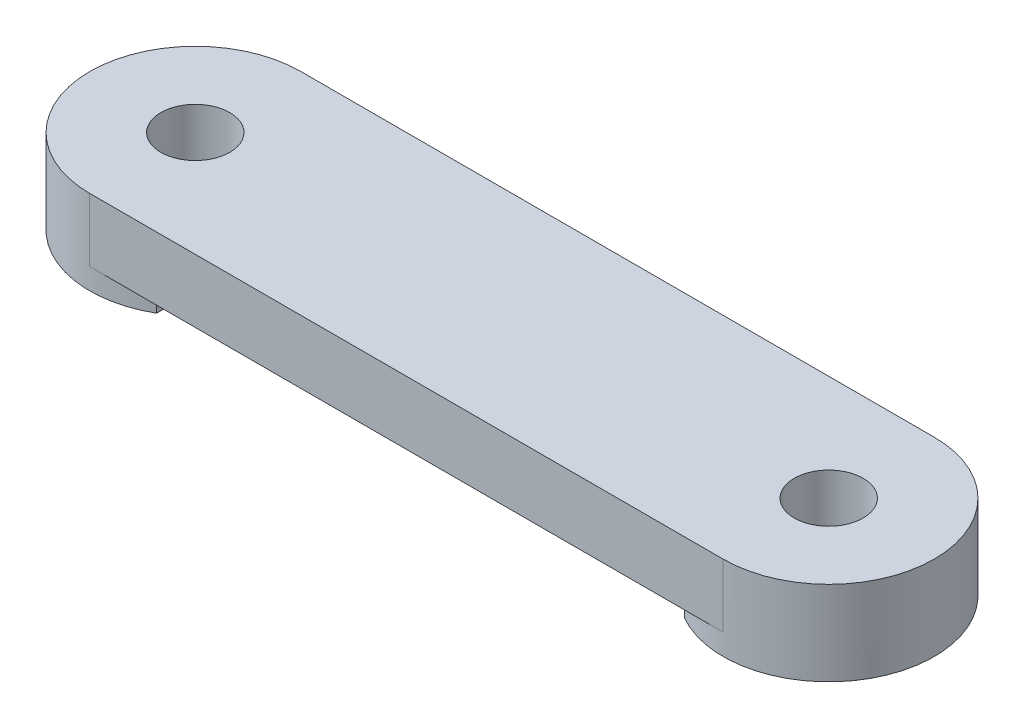
ISO-10303-21;
HEADER;
FILE_DESCRIPTION(('STEP AP214'),'2;1');
FILE_NAME('part.step','',(''),(''),'','','');
FILE_SCHEMA(('AUTOMOTIVE_DESIGN { 1 0 10303 214 1 1 1 1 }'));
ENDSEC;
DATA;
#1=APPLICATION_CONTEXT('core data for automotive mechanical design processes');
#2=APPLICATION_PROTOCOL_DEFINITION('international standard','automotive_design',2000,#1);
#3=PRODUCT_CONTEXT('',#1,'mechanical');
#4=PRODUCT('Part','Part','',(#3));
#5=PRODUCT_RELATED_PRODUCT_CATEGORY('part','',(#4));
#6=PRODUCT_DEFINITION_FORMATION('','',#4);
#7=PRODUCT_DEFINITION_CONTEXT('part definition',#1,'design');
#8=PRODUCT_DEFINITION('design','',#6,#7);
#9=PRODUCT_DEFINITION_SHAPE('','',#8);
#10=(LENGTH_UNIT() NAMED_UNIT(*) SI_UNIT(.MILLI.,.METRE.));
#11=(NAMED_UNIT(*) PLANE_ANGLE_UNIT() SI_UNIT($,.RADIAN.));
#12=(NAMED_UNIT(*) SI_UNIT($,.STERADIAN.) SOLID_ANGLE_UNIT());
#13=UNCERTAINTY_MEASURE_WITH_UNIT(LENGTH_MEASURE(1.E-05),#10,'distance_accuracy_value','');
#14=(GEOMETRIC_REPRESENTATION_CONTEXT(3) GLOBAL_UNCERTAINTY_ASSIGNED_CONTEXT((#13)) GLOBAL_UNIT_ASSIGNED_CONTEXT((#10,
#11,#12)) REPRESENTATION_CONTEXT('',''));
#15=CARTESIAN_POINT('',(0.,0.,0.));
#16=DIRECTION('',(0.,0.,1.));
#17=DIRECTION('',(1.,0.,0.));
#18=AXIS2_PLACEMENT_3D('',#15,#16,#17);
#19=CARTESIAN_POINT('',(-15.,1.,0.));
#20=DIRECTION('',(0.,1.,0.));
#21=DIRECTION('',(0.,0.,1.));
#22=AXIS2_PLACEMENT_3D('',#19,#20,#21);
#23=PLANE('',#22);
#24=CARTESIAN_POINT('',(15.,1.,0.));
#25=DIRECTION('',(0.,1.,0.));
#26=DIRECTION('',(0.,0.,1.));
#27=AXIS2_PLACEMENT_3D('',#24,#25,#26);
#28=CIRCLE('',#27,5.);
#29=CARTESIAN_POINT('',(12.5,1.,4.33012701892219));
#30=VERTEX_POINT('',#29);
#31=CARTESIAN_POINT('',(15.,1.,4.99999999999999));
#32=VERTEX_POINT('',#31);
#33=EDGE_CURVE('E166',#30,#32,#28,.T.);
#34=ORIENTED_EDGE('',*,*,#33,.T.);
#35=DIRECTION('',(1.,0.,0.));
#36=VECTOR('',#35,1.);
#37=CARTESIAN_POINT('',(-15.,1.,5.));
#38=LINE('',#37,#36);
#39=CARTESIAN_POINT('',(-15.,1.,5.));
#40=VERTEX_POINT('',#39);
#41=EDGE_CURVE('E165',#40,#32,#38,.T.);
#42=ORIENTED_EDGE('',*,*,#41,.F.);
#43=CARTESIAN_POINT('',(-15.,1.,0.));
#44=DIRECTION('',(0.,1.,0.));
#45=DIRECTION('',(0.,0.,1.));
#46=AXIS2_PLACEMENT_3D('',#43,#44,#45);
#47=CIRCLE('',#46,5.);
#48=CARTESIAN_POINT('',(-12.5,1.,4.33012701892219));
#49=VERTEX_POINT('',#48);
#50=EDGE_CURVE('E117',#40,#49,#47,.T.);
#51=ORIENTED_EDGE('',*,*,#50,.T.);
#52=DIRECTION('',(0.,0.,-1.));
#53=VECTOR('',#52,1.);
#54=CARTESIAN_POINT('',(-12.5,1.,3.));
#55=LINE('',#54,#53);
#56=CARTESIAN_POINT('',(-12.5,1.,3.));
#57=VERTEX_POINT('',#56);
#58=EDGE_CURVE('E137',#49,#57,#55,.T.);
#59=ORIENTED_EDGE('',*,*,#58,.T.);
#60=CARTESIAN_POINT('',(-9.5,1.,3.));
#61=DIRECTION('',(0.,1.,0.));
#62=DIRECTION('',(0.,0.,1.));
#63=AXIS2_PLACEMENT_3D('',#60,#61,#62);
#64=CIRCLE('',#63,3.);
#65=CARTESIAN_POINT('',(-10.0001763184227,1.,0.0419899171082722));
#66=VERTEX_POINT('',#65);
#67=EDGE_CURVE('E129',#57,#66,#64,.F.);
#68=ORIENTED_EDGE('',*,*,#67,.T.);
#69=CARTESIAN_POINT('',(-15.,1.,-5.));
#70=VERTEX_POINT('',#69);
#71=EDGE_CURVE('E196',#66,#70,#47,.T.);
#72=ORIENTED_EDGE('',*,*,#71,.T.);
#73=DIRECTION('',(-1.,0.,0.));
#74=VECTOR('',#73,1.);
#75=CARTESIAN_POINT('',(15.,1.,-5.00000000000001));
#76=LINE('',#75,#74);
#77=CARTESIAN_POINT('',(15.,1.,-5.00000000000001));
#78=VERTEX_POINT('',#77);
#79=EDGE_CURVE('E172',#78,#70,#76,.T.);
#80=ORIENTED_EDGE('',*,*,#79,.F.);
#81=CARTESIAN_POINT('',(10.0001763184227,1.,0.0419899171082718));
#82=VERTEX_POINT('',#81);
#83=EDGE_CURVE('E162',#78,#82,#28,.T.);
#84=ORIENTED_EDGE('',*,*,#83,.T.);
#85=CARTESIAN_POINT('',(9.5,1.,3.));
#86=DIRECTION('',(0.,1.,0.));
#87=DIRECTION('',(0.,0.,1.));
#88=AXIS2_PLACEMENT_3D('',#85,#86,#87);
#89=CIRCLE('',#88,3.);
#90=CARTESIAN_POINT('',(12.5,1.,3.));
#91=VERTEX_POINT('',#90);
#92=EDGE_CURVE('E125',#82,#91,#89,.F.);
#93=ORIENTED_EDGE('',*,*,#92,.T.);
#94=DIRECTION('',(0.,0.,1.));
#95=VECTOR('',#94,1.);
#96=CARTESIAN_POINT('',(12.5,1.,3.));
#97=LINE('',#96,#95);
#98=EDGE_CURVE('E124',#91,#30,#97,.T.);
#99=ORIENTED_EDGE('',*,*,#98,.T.);
#100=EDGE_LOOP('',(#34,#42,#51,#59,#68,#72,#80,#84,#93,#99));
#101=FACE_BOUND('',#100,.T.);
#102=ADVANCED_FACE('F34',(#101),#23,.F.);
#103=CARTESIAN_POINT('',(-15.,1.,0.));
#104=DIRECTION('',(0.,-1.,0.));
#105=DIRECTION('',(0.,0.,-1.));
#106=AXIS2_PLACEMENT_3D('',#103,#104,#105);
#107=CYLINDRICAL_SURFACE('',#106,5.);
#108=CARTESIAN_POINT('',(-15.,0.,0.));
#109=DIRECTION('',(0.,1.,0.));
#110=DIRECTION('',(0.,0.,1.));
#111=AXIS2_PLACEMENT_3D('',#108,#109,#110);
#112=CIRCLE('',#111,5.);
#113=CARTESIAN_POINT('',(-10.0001763184227,0.,0.0419899171082722));
#114=VERTEX_POINT('',#113);
#115=CARTESIAN_POINT('',(-12.5,0.,4.33012701892219));
#116=VERTEX_POINT('',#115);
#117=EDGE_CURVE('E193',#114,#116,#112,.T.);
#118=ORIENTED_EDGE('',*,*,#117,.T.);
#119=DIRECTION('',(0.,-1.,0.));
#120=VECTOR('',#119,1.);
#121=CARTESIAN_POINT('',(-12.5,1.,4.33012701892219));
#122=LINE('',#121,#120);
#123=EDGE_CURVE('E147',#116,#49,#122,.F.);
#124=ORIENTED_EDGE('',*,*,#123,.T.);
#125=ORIENTED_EDGE('',*,*,#50,.F.);
#126=DIRECTION('',(0.,-1.,0.));
#127=VECTOR('',#126,1.);
#128=CARTESIAN_POINT('',(-15.,4.,5.));
#129=LINE('',#128,#127);
#130=CARTESIAN_POINT('',(-15.,4.,5.));
#131=VERTEX_POINT('',#130);
#132=EDGE_CURVE('E190',#131,#40,#129,.T.);
#133=ORIENTED_EDGE('',*,*,#132,.F.);
#134=CARTESIAN_POINT('',(-15.,4.,0.));
#135=DIRECTION('',(0.,1.,0.));
#136=DIRECTION('',(0.,0.,1.));
#137=AXIS2_PLACEMENT_3D('',#134,#135,#136);
#138=CIRCLE('',#137,5.);
#139=CARTESIAN_POINT('',(-15.,4.,-5.));
#140=VERTEX_POINT('',#139);
#141=EDGE_CURVE('E168',#140,#131,#138,.T.);
#142=ORIENTED_EDGE('',*,*,#141,.F.);
#143=DIRECTION('',(0.,-1.,0.));
#144=VECTOR('',#143,1.);
#145=CARTESIAN_POINT('',(-15.,4.,-5.));
#146=LINE('',#145,#144);
#147=EDGE_CURVE('E178',#140,#70,#146,.T.);
#148=ORIENTED_EDGE('',*,*,#147,.T.);
#149=ORIENTED_EDGE('',*,*,#71,.F.);
#150=DIRECTION('',(0.,-1.,0.));
#151=VECTOR('',#150,1.);
#152=CARTESIAN_POINT('',(-10.0001763184227,0.5,0.0419899171082722));
#153=LINE('',#152,#151);
#154=EDGE_CURVE('E144',#66,#114,#153,.T.);
#155=ORIENTED_EDGE('',*,*,#154,.T.);
#156=EDGE_LOOP('',(#118,#124,#125,#133,#142,#148,#149,#155));
#157=FACE_BOUND('',#156,.T.);
#158=ADVANCED_FACE('F36',(#157),#107,.T.);
#159=CARTESIAN_POINT('',(-15.,0.,0.));
#160=DIRECTION('',(0.,1.,0.));
#161=DIRECTION('',(0.,0.,1.));
#162=AXIS2_PLACEMENT_3D('',#159,#160,#161);
#163=PLANE('',#162);
#164=CARTESIAN_POINT('',(-15.,0.,0.));
#165=DIRECTION('',(0.,1.,0.));
#166=DIRECTION('',(0.,0.,1.));
#167=AXIS2_PLACEMENT_3D('',#164,#165,#166);
#168=CIRCLE('',#167,1.63195);
#169=CARTESIAN_POINT('',(-15.,0.,1.63195));
#170=VERTEX_POINT('',#169);
#171=EDGE_CURVE('E153',#170,#170,#168,.T.);
#172=ORIENTED_EDGE('',*,*,#171,.T.);
#173=EDGE_LOOP('',(#172));
#174=FACE_BOUND('',#173,.T.);
#175=CARTESIAN_POINT('',(-9.5,0.,3.));
#176=DIRECTION('',(0.,-1.,0.));
#177=DIRECTION('',(0.,0.,-1.));
#178=AXIS2_PLACEMENT_3D('',#175,#176,#177);
#179=CIRCLE('',#178,3.);
#180=CARTESIAN_POINT('',(-12.5,0.,3.));
#181=VERTEX_POINT('',#180);
#182=EDGE_CURVE('E136',#181,#114,#179,.T.);
#183=ORIENTED_EDGE('',*,*,#182,.F.);
#184=DIRECTION('',(0.,0.,1.));
#185=VECTOR('',#184,1.);
#186=CARTESIAN_POINT('',(-12.5,0.,0.));
#187=LINE('',#186,#185);
#188=EDGE_CURVE('E11',#181,#116,#187,.T.);
#189=ORIENTED_EDGE('',*,*,#188,.T.);
#190=ORIENTED_EDGE('',*,*,#117,.F.);
#191=EDGE_LOOP('',(#183,#189,#190));
#192=FACE_BOUND('',#191,.T.);
#193=ADVANCED_FACE('F225',(#174,#192),#163,.F.);
#194=CARTESIAN_POINT('',(-15.,4.,5.));
#195=DIRECTION('',(0.,0.,-1.));
#196=DIRECTION('',(-1.,0.,0.));
#197=AXIS2_PLACEMENT_3D('',#194,#195,#196);
#198=PLANE('',#197);
#199=ORIENTED_EDGE('',*,*,#41,.T.);
#200=DIRECTION('',(0.,-1.,0.));
#201=VECTOR('',#200,1.);
#202=CARTESIAN_POINT('',(15.,4.,4.99999999999999));
#203=LINE('',#202,#201);
#204=CARTESIAN_POINT('',(15.,4.,4.99999999999999));
#205=VERTEX_POINT('',#204);
#206=EDGE_CURVE('E187',#205,#32,#203,.T.);
#207=ORIENTED_EDGE('',*,*,#206,.F.);
#208=DIRECTION('',(1.,0.,0.));
#209=VECTOR('',#208,1.);
#210=CARTESIAN_POINT('',(-15.,4.,5.));
#211=LINE('',#210,#209);
#212=EDGE_CURVE('E171',#131,#205,#211,.T.);
#213=ORIENTED_EDGE('',*,*,#212,.F.);
#214=ORIENTED_EDGE('',*,*,#132,.T.);
#215=EDGE_LOOP('',(#199,#207,#213,#214));
#216=FACE_BOUND('',#215,.T.);
#217=ADVANCED_FACE('F220',(#216),#198,.F.);
#218=CARTESIAN_POINT('',(15.,4.,0.));
#219=DIRECTION('',(0.,-1.,0.));
#220=DIRECTION('',(0.,0.,-1.));
#221=AXIS2_PLACEMENT_3D('',#218,#219,#220);
#222=CYLINDRICAL_SURFACE('',#221,5.);
#223=ORIENTED_EDGE('',*,*,#33,.F.);
#224=DIRECTION('',(0.,-1.,0.));
#225=VECTOR('',#224,1.);
#226=CARTESIAN_POINT('',(12.5,4.,4.33012701892219));
#227=LINE('',#226,#225);
#228=CARTESIAN_POINT('',(12.5,0.,4.33012701892219));
#229=VERTEX_POINT('',#228);
#230=EDGE_CURVE('E142',#30,#229,#227,.T.);
#231=ORIENTED_EDGE('',*,*,#230,.T.);
#232=CARTESIAN_POINT('',(15.,0.,0.));
#233=DIRECTION('',(0.,1.,0.));
#234=DIRECTION('',(0.,0.,1.));
#235=AXIS2_PLACEMENT_3D('',#232,#233,#234);
#236=CIRCLE('',#235,5.);
#237=CARTESIAN_POINT('',(10.0001763184227,0.,0.0419899171082722));
#238=VERTEX_POINT('',#237);
#239=EDGE_CURVE('E128',#229,#238,#236,.T.);
#240=ORIENTED_EDGE('',*,*,#239,.T.);
#241=DIRECTION('',(0.,-1.,0.));
#242=VECTOR('',#241,1.);
#243=CARTESIAN_POINT('',(10.0001763184227,0.5,0.0419899171082722));
#244=LINE('',#243,#242);
#245=EDGE_CURVE('E57',#238,#82,#244,.F.);
#246=ORIENTED_EDGE('',*,*,#245,.T.);
#247=ORIENTED_EDGE('',*,*,#83,.F.);
#248=DIRECTION('',(0.,-1.,0.));
#249=VECTOR('',#248,1.);
#250=CARTESIAN_POINT('',(15.,4.,-5.00000000000001));
#251=LINE('',#250,#249);
#252=CARTESIAN_POINT('',(15.,4.,-5.00000000000001));
#253=VERTEX_POINT('',#252);
#254=EDGE_CURVE('E184',#253,#78,#251,.T.);
#255=ORIENTED_EDGE('',*,*,#254,.F.);
#256=CARTESIAN_POINT('',(15.,4.,0.));
#257=DIRECTION('',(0.,1.,0.));
#258=DIRECTION('',(0.,0.,1.));
#259=AXIS2_PLACEMENT_3D('',#256,#257,#258);
#260=CIRCLE('',#259,5.);
#261=EDGE_CURVE('E174',#205,#253,#260,.T.);
#262=ORIENTED_EDGE('',*,*,#261,.F.);
#263=ORIENTED_EDGE('',*,*,#206,.T.);
#264=EDGE_LOOP('',(#223,#231,#240,#246,#247,#255,#262,#263));
#265=FACE_BOUND('',#264,.T.);
#266=ADVANCED_FACE('F217',(#265),#222,.T.);
#267=CARTESIAN_POINT('',(15.,4.,-5.00000000000001));
#268=DIRECTION('',(0.,0.,1.));
#269=DIRECTION('',(1.,0.,0.));
#270=AXIS2_PLACEMENT_3D('',#267,#268,#269);
#271=PLANE('',#270);
#272=ORIENTED_EDGE('',*,*,#79,.T.);
#273=ORIENTED_EDGE('',*,*,#147,.F.);
#274=DIRECTION('',(-1.,0.,0.));
#275=VECTOR('',#274,1.);
#276=CARTESIAN_POINT('',(15.,4.,-5.00000000000001));
#277=LINE('',#276,#275);
#278=EDGE_CURVE('E176',#253,#140,#277,.T.);
#279=ORIENTED_EDGE('',*,*,#278,.F.);
#280=ORIENTED_EDGE('',*,*,#254,.T.);
#281=EDGE_LOOP('',(#272,#273,#279,#280));
#282=FACE_BOUND('',#281,.T.);
#283=ADVANCED_FACE('F206',(#282),#271,.F.);
#284=CARTESIAN_POINT('',(-15.,4.,0.));
#285=DIRECTION('',(0.,1.,0.));
#286=DIRECTION('',(0.,0.,1.));
#287=AXIS2_PLACEMENT_3D('',#284,#285,#286);
#288=PLANE('',#287);
#289=CARTESIAN_POINT('',(-15.,4.,0.));
#290=DIRECTION('',(0.,1.,0.));
#291=DIRECTION('',(0.,0.,1.));
#292=AXIS2_PLACEMENT_3D('',#289,#290,#291);
#293=CIRCLE('',#292,1.63195);
#294=CARTESIAN_POINT('',(-15.,4.,1.63195));
#295=VERTEX_POINT('',#294);
#296=EDGE_CURVE('E150',#295,#295,#293,.T.);
#297=ORIENTED_EDGE('',*,*,#296,.F.);
#298=EDGE_LOOP('',(#297));
#299=FACE_BOUND('',#298,.T.);
#300=CARTESIAN_POINT('',(15.,4.,0.));
#301=DIRECTION('',(0.,1.,0.));
#302=DIRECTION('',(0.,0.,1.));
#303=AXIS2_PLACEMENT_3D('',#300,#301,#302);
#304=CIRCLE('',#303,1.63195);
#305=CARTESIAN_POINT('',(15.,4.,1.63194999999999));
#306=VERTEX_POINT('',#305);
#307=EDGE_CURVE('E156',#306,#306,#304,.T.);
#308=ORIENTED_EDGE('',*,*,#307,.F.);
#309=EDGE_LOOP('',(#308));
#310=FACE_BOUND('',#309,.T.);
#311=ORIENTED_EDGE('',*,*,#141,.T.);
#312=ORIENTED_EDGE('',*,*,#212,.T.);
#313=ORIENTED_EDGE('',*,*,#261,.T.);
#314=ORIENTED_EDGE('',*,*,#278,.T.);
#315=EDGE_LOOP('',(#311,#312,#313,#314));
#316=FACE_BOUND('',#315,.T.);
#317=ADVANCED_FACE('F212',(#299,#310,#316),#288,.T.);
#318=CARTESIAN_POINT('',(15.,0.,0.));
#319=DIRECTION('',(0.,1.,0.));
#320=DIRECTION('',(0.,0.,1.));
#321=AXIS2_PLACEMENT_3D('',#318,#319,#320);
#322=PLANE('',#321);
#323=CARTESIAN_POINT('',(15.,0.,0.));
#324=DIRECTION('',(0.,1.,0.));
#325=DIRECTION('',(0.,0.,1.));
#326=AXIS2_PLACEMENT_3D('',#323,#324,#325);
#327=CIRCLE('',#326,1.63195);
#328=CARTESIAN_POINT('',(15.,0.,1.63194999999999));
#329=VERTEX_POINT('',#328);
#330=EDGE_CURVE('E159',#329,#329,#327,.T.);
#331=ORIENTED_EDGE('',*,*,#330,.T.);
#332=EDGE_LOOP('',(#331));
#333=FACE_BOUND('',#332,.T.);
#334=ORIENTED_EDGE('',*,*,#239,.F.);
#335=DIRECTION('',(0.,0.,1.));
#336=VECTOR('',#335,1.);
#337=CARTESIAN_POINT('',(12.5,0.,3.));
#338=LINE('',#337,#336);
#339=CARTESIAN_POINT('',(12.5,0.,3.));
#340=VERTEX_POINT('',#339);
#341=EDGE_CURVE('E121',#340,#229,#338,.T.);
#342=ORIENTED_EDGE('',*,*,#341,.F.);
#343=CARTESIAN_POINT('',(9.5,0.,3.));
#344=DIRECTION('',(0.,1.,0.));
#345=DIRECTION('',(0.,0.,1.));
#346=AXIS2_PLACEMENT_3D('',#343,#344,#345);
#347=CIRCLE('',#346,3.);
#348=EDGE_CURVE('E42',#340,#238,#347,.T.);
#349=ORIENTED_EDGE('',*,*,#348,.T.);
#350=EDGE_LOOP('',(#334,#342,#349));
#351=FACE_BOUND('',#350,.T.);
#352=ADVANCED_FACE('F127',(#333,#351),#322,.F.);
#353=CARTESIAN_POINT('',(15.,4.,0.));
#354=DIRECTION('',(0.,1.,0.));
#355=DIRECTION('',(0.,0.,1.));
#356=AXIS2_PLACEMENT_3D('',#353,#354,#355);
#357=CYLINDRICAL_SURFACE('',#356,1.63195);
#358=ORIENTED_EDGE('',*,*,#330,.F.);
#359=EDGE_LOOP('',(#358));
#360=FACE_BOUND('',#359,.T.);
#361=ORIENTED_EDGE('',*,*,#307,.T.);
#362=EDGE_LOOP('',(#361));
#363=FACE_BOUND('',#362,.T.);
#364=ADVANCED_FACE('F256',(#360,#363),#357,.F.);
#365=CARTESIAN_POINT('',(-15.,4.,0.));
#366=DIRECTION('',(0.,1.,0.));
#367=DIRECTION('',(0.,0.,1.));
#368=AXIS2_PLACEMENT_3D('',#365,#366,#367);
#369=CYLINDRICAL_SURFACE('',#368,1.63195);
#370=ORIENTED_EDGE('',*,*,#171,.F.);
#371=EDGE_LOOP('',(#370));
#372=FACE_BOUND('',#371,.T.);
#373=ORIENTED_EDGE('',*,*,#296,.T.);
#374=EDGE_LOOP('',(#373));
#375=FACE_BOUND('',#374,.T.);
#376=ADVANCED_FACE('F253',(#372,#375),#369,.F.);
#377=CARTESIAN_POINT('',(12.5,9.48528137423857,3.));
#378=DIRECTION('',(1.,0.,0.));
#379=DIRECTION('',(0.,0.,-1.));
#380=AXIS2_PLACEMENT_3D('',#377,#378,#379);
#381=PLANE('',#380);
#382=ORIENTED_EDGE('',*,*,#98,.F.);
#383=DIRECTION('',(0.,-1.,0.));
#384=VECTOR('',#383,1.);
#385=CARTESIAN_POINT('',(12.5,9.48528137423857,3.));
#386=LINE('',#385,#384);
#387=EDGE_CURVE('E112',#91,#340,#386,.T.);
#388=ORIENTED_EDGE('',*,*,#387,.T.);
#389=ORIENTED_EDGE('',*,*,#341,.T.);
#390=ORIENTED_EDGE('',*,*,#230,.F.);
#391=EDGE_LOOP('',(#382,#388,#389,#390));
#392=FACE_BOUND('',#391,.T.);
#393=ADVANCED_FACE('F120',(#392),#381,.F.);
#394=CARTESIAN_POINT('',(9.5,9.48528137423857,3.));
#395=DIRECTION('',(0.,-1.,0.));
#396=DIRECTION('',(0.,0.,-1.));
#397=AXIS2_PLACEMENT_3D('',#394,#395,#396);
#398=CYLINDRICAL_SURFACE('',#397,3.);
#399=ORIENTED_EDGE('',*,*,#348,.F.);
#400=ORIENTED_EDGE('',*,*,#387,.F.);
#401=ORIENTED_EDGE('',*,*,#92,.F.);
#402=ORIENTED_EDGE('',*,*,#245,.F.);
#403=EDGE_LOOP('',(#399,#400,#401,#402));
#404=FACE_BOUND('',#403,.T.);
#405=ADVANCED_FACE('F111',(#404),#398,.F.);
#406=CARTESIAN_POINT('',(-12.5,9.48528137423857,3.));
#407=DIRECTION('',(-1.,0.,0.));
#408=DIRECTION('',(0.,0.,1.));
#409=AXIS2_PLACEMENT_3D('',#406,#407,#408);
#410=PLANE('',#409);
#411=ORIENTED_EDGE('',*,*,#188,.F.);
#412=DIRECTION('',(0.,-1.,0.));
#413=VECTOR('',#412,1.);
#414=CARTESIAN_POINT('',(-12.5,9.48528137423857,3.));
#415=LINE('',#414,#413);
#416=EDGE_CURVE('E49',#57,#181,#415,.T.);
#417=ORIENTED_EDGE('',*,*,#416,.F.);
#418=ORIENTED_EDGE('',*,*,#58,.F.);
#419=ORIENTED_EDGE('',*,*,#123,.F.);
#420=EDGE_LOOP('',(#411,#417,#418,#419));
#421=FACE_BOUND('',#420,.T.);
#422=ADVANCED_FACE('F222',(#421),#410,.F.);
#423=CARTESIAN_POINT('',(-9.5,9.48528137423857,3.));
#424=DIRECTION('',(0.,-1.,0.));
#425=DIRECTION('',(0.,0.,-1.));
#426=AXIS2_PLACEMENT_3D('',#423,#424,#425);
#427=CYLINDRICAL_SURFACE('',#426,3.);
#428=ORIENTED_EDGE('',*,*,#67,.F.);
#429=ORIENTED_EDGE('',*,*,#416,.T.);
#430=ORIENTED_EDGE('',*,*,#182,.T.);
#431=ORIENTED_EDGE('',*,*,#154,.F.);
#432=EDGE_LOOP('',(#428,#429,#430,#431));
#433=FACE_BOUND('',#432,.T.);
#434=ADVANCED_FACE('F226',(#433),#427,.F.);
#435=CLOSED_SHELL('',(#102,#158,#193,#217,#266,#283,#317,#352,#364,#376,#393,#405,#422,#434));
#436=MANIFOLD_SOLID_BREP('B2',#435);
#437=ADVANCED_BREP_SHAPE_REPRESENTATION('',(#18,#436),#14);
#438=SHAPE_DEFINITION_REPRESENTATION(#9,#437);
ENDSEC;
END-ISO-10303-21;
